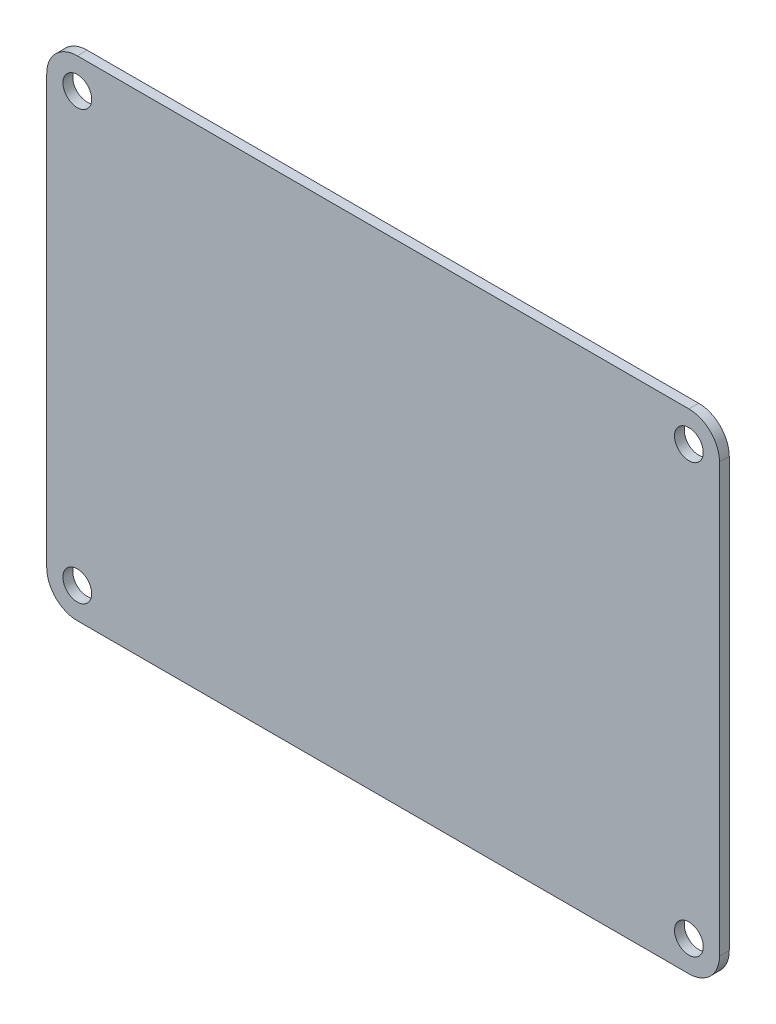
ISO-10303-21;
HEADER;
FILE_DESCRIPTION(('STEP AP214'),'2;1');
FILE_NAME('part.step','',(''),(''),'','','');
FILE_SCHEMA(('AUTOMOTIVE_DESIGN { 1 0 10303 214 1 1 1 1 }'));
ENDSEC;
DATA;
#1=APPLICATION_CONTEXT('core data for automotive mechanical design processes');
#2=APPLICATION_PROTOCOL_DEFINITION('international standard','automotive_design',2000,#1);
#3=PRODUCT_CONTEXT('',#1,'mechanical');
#4=PRODUCT('Part','Part','',(#3));
#5=PRODUCT_RELATED_PRODUCT_CATEGORY('part','',(#4));
#6=PRODUCT_DEFINITION_FORMATION('','',#4);
#7=PRODUCT_DEFINITION_CONTEXT('part definition',#1,'design');
#8=PRODUCT_DEFINITION('design','',#6,#7);
#9=PRODUCT_DEFINITION_SHAPE('','',#8);
#10=(LENGTH_UNIT() NAMED_UNIT(*) SI_UNIT(.MILLI.,.METRE.));
#11=(NAMED_UNIT(*) PLANE_ANGLE_UNIT() SI_UNIT($,.RADIAN.));
#12=(NAMED_UNIT(*) SI_UNIT($,.STERADIAN.) SOLID_ANGLE_UNIT());
#13=UNCERTAINTY_MEASURE_WITH_UNIT(LENGTH_MEASURE(1.E-05),#10,'distance_accuracy_value','');
#14=(GEOMETRIC_REPRESENTATION_CONTEXT(3) GLOBAL_UNCERTAINTY_ASSIGNED_CONTEXT((#13)) GLOBAL_UNIT_ASSIGNED_CONTEXT((#10,
#11,#12)) REPRESENTATION_CONTEXT('',''));
#15=CARTESIAN_POINT('',(0.,0.,0.));
#16=DIRECTION('',(0.,0.,1.));
#17=DIRECTION('',(1.,0.,0.));
#18=AXIS2_PLACEMENT_3D('',#15,#16,#17);
#19=CARTESIAN_POINT('',(0.,0.,1.6));
#20=DIRECTION('',(0.,0.,-1.));
#21=DIRECTION('',(-1.,0.,0.));
#22=AXIS2_PLACEMENT_3D('',#19,#20,#21);
#23=PLANE('',#22);
#24=DIRECTION('',(-1.,0.,0.));
#25=VECTOR('',#24,1.);
#26=CARTESIAN_POINT('',(-55.,40.,1.6));
#27=LINE('',#26,#25);
#28=CARTESIAN_POINT('',(50.,40.,1.6));
#29=VERTEX_POINT('',#28);
#30=CARTESIAN_POINT('',(-50.,40.,1.6));
#31=VERTEX_POINT('',#30);
#32=EDGE_CURVE('E172',#29,#31,#27,.T.);
#33=ORIENTED_EDGE('',*,*,#32,.T.);
#34=CARTESIAN_POINT('',(-50.,35.,1.6));
#35=DIRECTION('',(0.,0.,-1.));
#36=DIRECTION('',(-1.,0.,0.));
#37=AXIS2_PLACEMENT_3D('',#34,#35,#36);
#38=CIRCLE('',#37,5.);
#39=CARTESIAN_POINT('',(-55.,35.,1.6));
#40=VERTEX_POINT('',#39);
#41=EDGE_CURVE('E153',#31,#40,#38,.F.);
#42=ORIENTED_EDGE('',*,*,#41,.T.);
#43=DIRECTION('',(0.,-1.,0.));
#44=VECTOR('',#43,1.);
#45=CARTESIAN_POINT('',(-55.,-40.,1.6));
#46=LINE('',#45,#44);
#47=CARTESIAN_POINT('',(-55.,-35.,1.6));
#48=VERTEX_POINT('',#47);
#49=EDGE_CURVE('E123',#40,#48,#46,.T.);
#50=ORIENTED_EDGE('',*,*,#49,.T.);
#51=CARTESIAN_POINT('',(-50.,-35.,1.6));
#52=DIRECTION('',(0.,0.,-1.));
#53=DIRECTION('',(-1.,0.,0.));
#54=AXIS2_PLACEMENT_3D('',#51,#52,#53);
#55=CIRCLE('',#54,5.);
#56=CARTESIAN_POINT('',(-50.,-40.,1.6));
#57=VERTEX_POINT('',#56);
#58=EDGE_CURVE('E59',#48,#57,#55,.F.);
#59=ORIENTED_EDGE('',*,*,#58,.T.);
#60=DIRECTION('',(1.,0.,0.));
#61=VECTOR('',#60,1.);
#62=CARTESIAN_POINT('',(-55.,-40.,1.6));
#63=LINE('',#62,#61);
#64=CARTESIAN_POINT('',(50.,-40.,1.6));
#65=VERTEX_POINT('',#64);
#66=EDGE_CURVE('E139',#57,#65,#63,.T.);
#67=ORIENTED_EDGE('',*,*,#66,.T.);
#68=CARTESIAN_POINT('',(50.,-35.,1.6));
#69=DIRECTION('',(0.,0.,-1.));
#70=DIRECTION('',(-1.,0.,0.));
#71=AXIS2_PLACEMENT_3D('',#68,#69,#70);
#72=CIRCLE('',#71,5.);
#73=CARTESIAN_POINT('',(55.,-35.,1.6));
#74=VERTEX_POINT('',#73);
#75=EDGE_CURVE('E150',#65,#74,#72,.F.);
#76=ORIENTED_EDGE('',*,*,#75,.T.);
#77=DIRECTION('',(0.,1.,0.));
#78=VECTOR('',#77,1.);
#79=CARTESIAN_POINT('',(55.,-40.,1.6));
#80=LINE('',#79,#78);
#81=CARTESIAN_POINT('',(55.,35.,1.6));
#82=VERTEX_POINT('',#81);
#83=EDGE_CURVE('E133',#74,#82,#80,.T.);
#84=ORIENTED_EDGE('',*,*,#83,.T.);
#85=CARTESIAN_POINT('',(50.,35.,1.6));
#86=DIRECTION('',(0.,0.,-1.));
#87=DIRECTION('',(-1.,0.,0.));
#88=AXIS2_PLACEMENT_3D('',#85,#86,#87);
#89=CIRCLE('',#88,5.);
#90=EDGE_CURVE('E148',#82,#29,#89,.F.);
#91=ORIENTED_EDGE('',*,*,#90,.T.);
#92=EDGE_LOOP('',(#33,#42,#50,#59,#67,#76,#84,#91));
#93=FACE_BOUND('',#92,.T.);
#94=CARTESIAN_POINT('',(50.,35.,1.6));
#95=DIRECTION('',(0.,0.,1.));
#96=DIRECTION('',(1.,0.,0.));
#97=AXIS2_PLACEMENT_3D('',#94,#95,#96);
#98=CIRCLE('',#97,2.35);
#99=CARTESIAN_POINT('',(52.35,35.,1.6));
#100=VERTEX_POINT('',#99);
#101=EDGE_CURVE('E177',#100,#100,#98,.T.);
#102=ORIENTED_EDGE('',*,*,#101,.F.);
#103=EDGE_LOOP('',(#102));
#104=FACE_BOUND('',#103,.T.);
#105=CARTESIAN_POINT('',(-50.,35.,1.6));
#106=DIRECTION('',(0.,0.,1.));
#107=DIRECTION('',(1.,0.,0.));
#108=AXIS2_PLACEMENT_3D('',#105,#106,#107);
#109=CIRCLE('',#108,2.35);
#110=CARTESIAN_POINT('',(-47.65,35.,1.6));
#111=VERTEX_POINT('',#110);
#112=EDGE_CURVE('E186',#111,#111,#109,.T.);
#113=ORIENTED_EDGE('',*,*,#112,.F.);
#114=EDGE_LOOP('',(#113));
#115=FACE_BOUND('',#114,.T.);
#116=CARTESIAN_POINT('',(-50.,-35.,1.6));
#117=DIRECTION('',(0.,0.,1.));
#118=DIRECTION('',(1.,0.,0.));
#119=AXIS2_PLACEMENT_3D('',#116,#117,#118);
#120=CIRCLE('',#119,2.35);
#121=CARTESIAN_POINT('',(-47.65,-35.,1.6));
#122=VERTEX_POINT('',#121);
#123=EDGE_CURVE('E191',#122,#122,#120,.T.);
#124=ORIENTED_EDGE('',*,*,#123,.F.);
#125=EDGE_LOOP('',(#124));
#126=FACE_BOUND('',#125,.T.);
#127=CARTESIAN_POINT('',(50.,-35.,1.6));
#128=DIRECTION('',(0.,0.,1.));
#129=DIRECTION('',(1.,0.,0.));
#130=AXIS2_PLACEMENT_3D('',#127,#128,#129);
#131=CIRCLE('',#130,2.35);
#132=CARTESIAN_POINT('',(52.35,-35.,1.6));
#133=VERTEX_POINT('',#132);
#134=EDGE_CURVE('E197',#133,#133,#131,.T.);
#135=ORIENTED_EDGE('',*,*,#134,.F.);
#136=EDGE_LOOP('',(#135));
#137=FACE_BOUND('',#136,.T.);
#138=ADVANCED_FACE('F37',(#93,#104,#115,#126,#137),#23,.F.);
#139=CARTESIAN_POINT('',(0.,0.,0.));
#140=DIRECTION('',(0.,0.,-1.));
#141=DIRECTION('',(-1.,0.,0.));
#142=AXIS2_PLACEMENT_3D('',#139,#140,#141);
#143=PLANE('',#142);
#144=CARTESIAN_POINT('',(-50.,-35.,0.));
#145=DIRECTION('',(0.,0.,1.));
#146=DIRECTION('',(1.,0.,0.));
#147=AXIS2_PLACEMENT_3D('',#144,#145,#146);
#148=CIRCLE('',#147,2.35);
#149=CARTESIAN_POINT('',(-47.65,-35.,0.));
#150=VERTEX_POINT('',#149);
#151=EDGE_CURVE('E194',#150,#150,#148,.T.);
#152=ORIENTED_EDGE('',*,*,#151,.T.);
#153=EDGE_LOOP('',(#152));
#154=FACE_BOUND('',#153,.T.);
#155=CARTESIAN_POINT('',(50.,35.,0.));
#156=DIRECTION('',(0.,0.,1.));
#157=DIRECTION('',(1.,0.,0.));
#158=AXIS2_PLACEMENT_3D('',#155,#156,#157);
#159=CIRCLE('',#158,2.35);
#160=CARTESIAN_POINT('',(52.35,35.,0.));
#161=VERTEX_POINT('',#160);
#162=EDGE_CURVE('E179',#161,#161,#159,.T.);
#163=ORIENTED_EDGE('',*,*,#162,.T.);
#164=EDGE_LOOP('',(#163));
#165=FACE_BOUND('',#164,.T.);
#166=DIRECTION('',(0.,-1.,0.));
#167=VECTOR('',#166,1.);
#168=CARTESIAN_POINT('',(-55.,-40.,0.));
#169=LINE('',#168,#167);
#170=CARTESIAN_POINT('',(-55.,35.,0.));
#171=VERTEX_POINT('',#170);
#172=CARTESIAN_POINT('',(-55.,-35.,0.));
#173=VERTEX_POINT('',#172);
#174=EDGE_CURVE('E121',#171,#173,#169,.T.);
#175=ORIENTED_EDGE('',*,*,#174,.F.);
#176=CARTESIAN_POINT('',(-50.,35.,0.));
#177=DIRECTION('',(0.,0.,-1.));
#178=DIRECTION('',(-1.,0.,0.));
#179=AXIS2_PLACEMENT_3D('',#176,#177,#178);
#180=CIRCLE('',#179,5.);
#181=CARTESIAN_POINT('',(-50.,40.,0.));
#182=VERTEX_POINT('',#181);
#183=EDGE_CURVE('E104',#171,#182,#180,.T.);
#184=ORIENTED_EDGE('',*,*,#183,.T.);
#185=DIRECTION('',(-1.,0.,0.));
#186=VECTOR('',#185,1.);
#187=CARTESIAN_POINT('',(-55.,40.,0.));
#188=LINE('',#187,#186);
#189=CARTESIAN_POINT('',(50.,40.,0.));
#190=VERTEX_POINT('',#189);
#191=EDGE_CURVE('E131',#190,#182,#188,.T.);
#192=ORIENTED_EDGE('',*,*,#191,.F.);
#193=CARTESIAN_POINT('',(50.,35.,0.));
#194=DIRECTION('',(0.,0.,-1.));
#195=DIRECTION('',(-1.,0.,0.));
#196=AXIS2_PLACEMENT_3D('',#193,#194,#195);
#197=CIRCLE('',#196,5.);
#198=CARTESIAN_POINT('',(55.,35.,0.));
#199=VERTEX_POINT('',#198);
#200=EDGE_CURVE('E124',#190,#199,#197,.T.);
#201=ORIENTED_EDGE('',*,*,#200,.T.);
#202=DIRECTION('',(0.,1.,0.));
#203=VECTOR('',#202,1.);
#204=CARTESIAN_POINT('',(55.,-40.,0.));
#205=LINE('',#204,#203);
#206=CARTESIAN_POINT('',(55.,-35.,0.));
#207=VERTEX_POINT('',#206);
#208=EDGE_CURVE('E135',#207,#199,#205,.T.);
#209=ORIENTED_EDGE('',*,*,#208,.F.);
#210=CARTESIAN_POINT('',(50.,-35.,0.));
#211=DIRECTION('',(0.,0.,-1.));
#212=DIRECTION('',(-1.,0.,0.));
#213=AXIS2_PLACEMENT_3D('',#210,#211,#212);
#214=CIRCLE('',#213,5.);
#215=CARTESIAN_POINT('',(50.,-40.,0.));
#216=VERTEX_POINT('',#215);
#217=EDGE_CURVE('E142',#207,#216,#214,.T.);
#218=ORIENTED_EDGE('',*,*,#217,.T.);
#219=DIRECTION('',(1.,0.,0.));
#220=VECTOR('',#219,1.);
#221=CARTESIAN_POINT('',(-55.,-40.,0.));
#222=LINE('',#221,#220);
#223=CARTESIAN_POINT('',(-50.,-40.,0.));
#224=VERTEX_POINT('',#223);
#225=EDGE_CURVE('E130',#224,#216,#222,.T.);
#226=ORIENTED_EDGE('',*,*,#225,.F.);
#227=CARTESIAN_POINT('',(-50.,-35.,0.));
#228=DIRECTION('',(0.,0.,-1.));
#229=DIRECTION('',(-1.,0.,0.));
#230=AXIS2_PLACEMENT_3D('',#227,#228,#229);
#231=CIRCLE('',#230,5.);
#232=EDGE_CURVE('E115',#224,#173,#231,.T.);
#233=ORIENTED_EDGE('',*,*,#232,.T.);
#234=EDGE_LOOP('',(#175,#184,#192,#201,#209,#218,#226,#233));
#235=FACE_BOUND('',#234,.T.);
#236=CARTESIAN_POINT('',(-50.,35.,0.));
#237=DIRECTION('',(0.,0.,1.));
#238=DIRECTION('',(1.,0.,0.));
#239=AXIS2_PLACEMENT_3D('',#236,#237,#238);
#240=CIRCLE('',#239,2.35);
#241=CARTESIAN_POINT('',(-47.65,35.,0.));
#242=VERTEX_POINT('',#241);
#243=EDGE_CURVE('E188',#242,#242,#240,.T.);
#244=ORIENTED_EDGE('',*,*,#243,.T.);
#245=EDGE_LOOP('',(#244));
#246=FACE_BOUND('',#245,.T.);
#247=CARTESIAN_POINT('',(50.,-35.,0.));
#248=DIRECTION('',(0.,0.,1.));
#249=DIRECTION('',(1.,0.,0.));
#250=AXIS2_PLACEMENT_3D('',#247,#248,#249);
#251=CIRCLE('',#250,2.35);
#252=CARTESIAN_POINT('',(52.35,-35.,0.));
#253=VERTEX_POINT('',#252);
#254=EDGE_CURVE('E200',#253,#253,#251,.T.);
#255=ORIENTED_EDGE('',*,*,#254,.T.);
#256=EDGE_LOOP('',(#255));
#257=FACE_BOUND('',#256,.T.);
#258=ADVANCED_FACE('F127',(#154,#165,#235,#246,#257),#143,.T.);
#259=CARTESIAN_POINT('',(55.,-40.,1.6));
#260=DIRECTION('',(-1.,0.,0.));
#261=DIRECTION('',(0.,0.,1.));
#262=AXIS2_PLACEMENT_3D('',#259,#260,#261);
#263=PLANE('',#262);
#264=ORIENTED_EDGE('',*,*,#83,.F.);
#265=DIRECTION('',(0.,0.,-1.));
#266=VECTOR('',#265,1.);
#267=CARTESIAN_POINT('',(55.,-35.,1.6));
#268=LINE('',#267,#266);
#269=EDGE_CURVE('E11',#74,#207,#268,.T.);
#270=ORIENTED_EDGE('',*,*,#269,.T.);
#271=ORIENTED_EDGE('',*,*,#208,.T.);
#272=DIRECTION('',(0.,0.,-1.));
#273=VECTOR('',#272,1.);
#274=CARTESIAN_POINT('',(55.,35.,1.6));
#275=LINE('',#274,#273);
#276=EDGE_CURVE('E45',#199,#82,#275,.F.);
#277=ORIENTED_EDGE('',*,*,#276,.T.);
#278=EDGE_LOOP('',(#264,#270,#271,#277));
#279=FACE_BOUND('',#278,.T.);
#280=ADVANCED_FACE('F163',(#279),#263,.F.);
#281=CARTESIAN_POINT('',(-55.,40.,1.6));
#282=DIRECTION('',(0.,-1.,0.));
#283=DIRECTION('',(0.,0.,-1.));
#284=AXIS2_PLACEMENT_3D('',#281,#282,#283);
#285=PLANE('',#284);
#286=ORIENTED_EDGE('',*,*,#191,.T.);
#287=DIRECTION('',(0.,0.,-1.));
#288=VECTOR('',#287,1.);
#289=CARTESIAN_POINT('',(-50.,40.,1.6));
#290=LINE('',#289,#288);
#291=EDGE_CURVE('E109',#182,#31,#290,.F.);
#292=ORIENTED_EDGE('',*,*,#291,.T.);
#293=ORIENTED_EDGE('',*,*,#32,.F.);
#294=DIRECTION('',(0.,0.,-1.));
#295=VECTOR('',#294,1.);
#296=CARTESIAN_POINT('',(50.,40.,1.6));
#297=LINE('',#296,#295);
#298=EDGE_CURVE('E114',#29,#190,#297,.T.);
#299=ORIENTED_EDGE('',*,*,#298,.T.);
#300=EDGE_LOOP('',(#286,#292,#293,#299));
#301=FACE_BOUND('',#300,.T.);
#302=ADVANCED_FACE('F176',(#301),#285,.F.);
#303=CARTESIAN_POINT('',(-55.,-40.,1.6));
#304=DIRECTION('',(1.,0.,0.));
#305=DIRECTION('',(0.,0.,-1.));
#306=AXIS2_PLACEMENT_3D('',#303,#304,#305);
#307=PLANE('',#306);
#308=ORIENTED_EDGE('',*,*,#49,.F.);
#309=DIRECTION('',(0.,0.,-1.));
#310=VECTOR('',#309,1.);
#311=CARTESIAN_POINT('',(-55.,35.,1.6));
#312=LINE('',#311,#310);
#313=EDGE_CURVE('E108',#40,#171,#312,.T.);
#314=ORIENTED_EDGE('',*,*,#313,.T.);
#315=ORIENTED_EDGE('',*,*,#174,.T.);
#316=DIRECTION('',(0.,0.,-1.));
#317=VECTOR('',#316,1.);
#318=CARTESIAN_POINT('',(-55.,-35.,1.6));
#319=LINE('',#318,#317);
#320=EDGE_CURVE('E125',#173,#48,#319,.F.);
#321=ORIENTED_EDGE('',*,*,#320,.T.);
#322=EDGE_LOOP('',(#308,#314,#315,#321));
#323=FACE_BOUND('',#322,.T.);
#324=ADVANCED_FACE('F120',(#323),#307,.F.);
#325=CARTESIAN_POINT('',(-55.,-40.,1.6));
#326=DIRECTION('',(0.,1.,0.));
#327=DIRECTION('',(0.,0.,1.));
#328=AXIS2_PLACEMENT_3D('',#325,#326,#327);
#329=PLANE('',#328);
#330=ORIENTED_EDGE('',*,*,#66,.F.);
#331=DIRECTION('',(0.,0.,-1.));
#332=VECTOR('',#331,1.);
#333=CARTESIAN_POINT('',(-50.,-40.,1.6));
#334=LINE('',#333,#332);
#335=EDGE_CURVE('E156',#57,#224,#334,.T.);
#336=ORIENTED_EDGE('',*,*,#335,.T.);
#337=ORIENTED_EDGE('',*,*,#225,.T.);
#338=DIRECTION('',(0.,0.,-1.));
#339=VECTOR('',#338,1.);
#340=CARTESIAN_POINT('',(50.,-40.,1.6));
#341=LINE('',#340,#339);
#342=EDGE_CURVE('E52',#216,#65,#341,.F.);
#343=ORIENTED_EDGE('',*,*,#342,.T.);
#344=EDGE_LOOP('',(#330,#336,#337,#343));
#345=FACE_BOUND('',#344,.T.);
#346=ADVANCED_FACE('F220',(#345),#329,.F.);
#347=CARTESIAN_POINT('',(50.,35.,1.6));
#348=DIRECTION('',(0.,0.,-1.));
#349=DIRECTION('',(-1.,0.,0.));
#350=AXIS2_PLACEMENT_3D('',#347,#348,#349);
#351=CYLINDRICAL_SURFACE('',#350,2.35);
#352=ORIENTED_EDGE('',*,*,#101,.T.);
#353=EDGE_LOOP('',(#352));
#354=FACE_BOUND('',#353,.T.);
#355=ORIENTED_EDGE('',*,*,#162,.F.);
#356=EDGE_LOOP('',(#355));
#357=FACE_BOUND('',#356,.T.);
#358=ADVANCED_FACE('F217',(#354,#357),#351,.F.);
#359=CARTESIAN_POINT('',(-50.,35.,1.6));
#360=DIRECTION('',(0.,0.,-1.));
#361=DIRECTION('',(-1.,0.,0.));
#362=AXIS2_PLACEMENT_3D('',#359,#360,#361);
#363=CYLINDRICAL_SURFACE('',#362,2.35);
#364=ORIENTED_EDGE('',*,*,#112,.T.);
#365=EDGE_LOOP('',(#364));
#366=FACE_BOUND('',#365,.T.);
#367=ORIENTED_EDGE('',*,*,#243,.F.);
#368=EDGE_LOOP('',(#367));
#369=FACE_BOUND('',#368,.T.);
#370=ADVANCED_FACE('F323',(#366,#369),#363,.F.);
#371=CARTESIAN_POINT('',(-50.,-35.,1.6));
#372=DIRECTION('',(0.,0.,-1.));
#373=DIRECTION('',(-1.,0.,0.));
#374=AXIS2_PLACEMENT_3D('',#371,#372,#373);
#375=CYLINDRICAL_SURFACE('',#374,2.35);
#376=ORIENTED_EDGE('',*,*,#123,.T.);
#377=EDGE_LOOP('',(#376));
#378=FACE_BOUND('',#377,.T.);
#379=ORIENTED_EDGE('',*,*,#151,.F.);
#380=EDGE_LOOP('',(#379));
#381=FACE_BOUND('',#380,.T.);
#382=ADVANCED_FACE('F313',(#378,#381),#375,.F.);
#383=CARTESIAN_POINT('',(50.,-35.,1.6));
#384=DIRECTION('',(0.,0.,-1.));
#385=DIRECTION('',(-1.,0.,0.));
#386=AXIS2_PLACEMENT_3D('',#383,#384,#385);
#387=CYLINDRICAL_SURFACE('',#386,2.35);
#388=ORIENTED_EDGE('',*,*,#134,.T.);
#389=EDGE_LOOP('',(#388));
#390=FACE_BOUND('',#389,.T.);
#391=ORIENTED_EDGE('',*,*,#254,.F.);
#392=EDGE_LOOP('',(#391));
#393=FACE_BOUND('',#392,.T.);
#394=ADVANCED_FACE('F206',(#390,#393),#387,.F.);
#395=CARTESIAN_POINT('',(-50.,35.,1.6));
#396=DIRECTION('',(0.,0.,-1.));
#397=DIRECTION('',(-1.,0.,0.));
#398=AXIS2_PLACEMENT_3D('',#395,#396,#397);
#399=CYLINDRICAL_SURFACE('',#398,5.);
#400=ORIENTED_EDGE('',*,*,#41,.F.);
#401=ORIENTED_EDGE('',*,*,#291,.F.);
#402=ORIENTED_EDGE('',*,*,#183,.F.);
#403=ORIENTED_EDGE('',*,*,#313,.F.);
#404=EDGE_LOOP('',(#400,#401,#402,#403));
#405=FACE_BOUND('',#404,.T.);
#406=ADVANCED_FACE('F107',(#405),#399,.T.);
#407=CARTESIAN_POINT('',(-50.,-35.,1.6));
#408=DIRECTION('',(0.,0.,-1.));
#409=DIRECTION('',(-1.,0.,0.));
#410=AXIS2_PLACEMENT_3D('',#407,#408,#409);
#411=CYLINDRICAL_SURFACE('',#410,5.);
#412=ORIENTED_EDGE('',*,*,#58,.F.);
#413=ORIENTED_EDGE('',*,*,#320,.F.);
#414=ORIENTED_EDGE('',*,*,#232,.F.);
#415=ORIENTED_EDGE('',*,*,#335,.F.);
#416=EDGE_LOOP('',(#412,#413,#414,#415));
#417=FACE_BOUND('',#416,.T.);
#418=ADVANCED_FACE('F231',(#417),#411,.T.);
#419=CARTESIAN_POINT('',(50.,-35.,1.6));
#420=DIRECTION('',(0.,0.,-1.));
#421=DIRECTION('',(-1.,0.,0.));
#422=AXIS2_PLACEMENT_3D('',#419,#420,#421);
#423=CYLINDRICAL_SURFACE('',#422,5.);
#424=ORIENTED_EDGE('',*,*,#75,.F.);
#425=ORIENTED_EDGE('',*,*,#342,.F.);
#426=ORIENTED_EDGE('',*,*,#217,.F.);
#427=ORIENTED_EDGE('',*,*,#269,.F.);
#428=EDGE_LOOP('',(#424,#425,#426,#427));
#429=FACE_BOUND('',#428,.T.);
#430=ADVANCED_FACE('F233',(#429),#423,.T.);
#431=CARTESIAN_POINT('',(50.,35.,1.6));
#432=DIRECTION('',(0.,0.,-1.));
#433=DIRECTION('',(-1.,0.,0.));
#434=AXIS2_PLACEMENT_3D('',#431,#432,#433);
#435=CYLINDRICAL_SURFACE('',#434,5.);
#436=ORIENTED_EDGE('',*,*,#90,.F.);
#437=ORIENTED_EDGE('',*,*,#276,.F.);
#438=ORIENTED_EDGE('',*,*,#200,.F.);
#439=ORIENTED_EDGE('',*,*,#298,.F.);
#440=EDGE_LOOP('',(#436,#437,#438,#439));
#441=FACE_BOUND('',#440,.T.);
#442=ADVANCED_FACE('F39',(#441),#435,.T.);
#443=CLOSED_SHELL('',(#138,#258,#280,#302,#324,#346,#358,#370,#382,#394,#406,#418,#430,#442));
#444=MANIFOLD_SOLID_BREP('B2',#443);
#445=ADVANCED_BREP_SHAPE_REPRESENTATION('',(#18,#444),#14);
#446=SHAPE_DEFINITION_REPRESENTATION(#9,#445);
ENDSEC;
END-ISO-10303-21;
